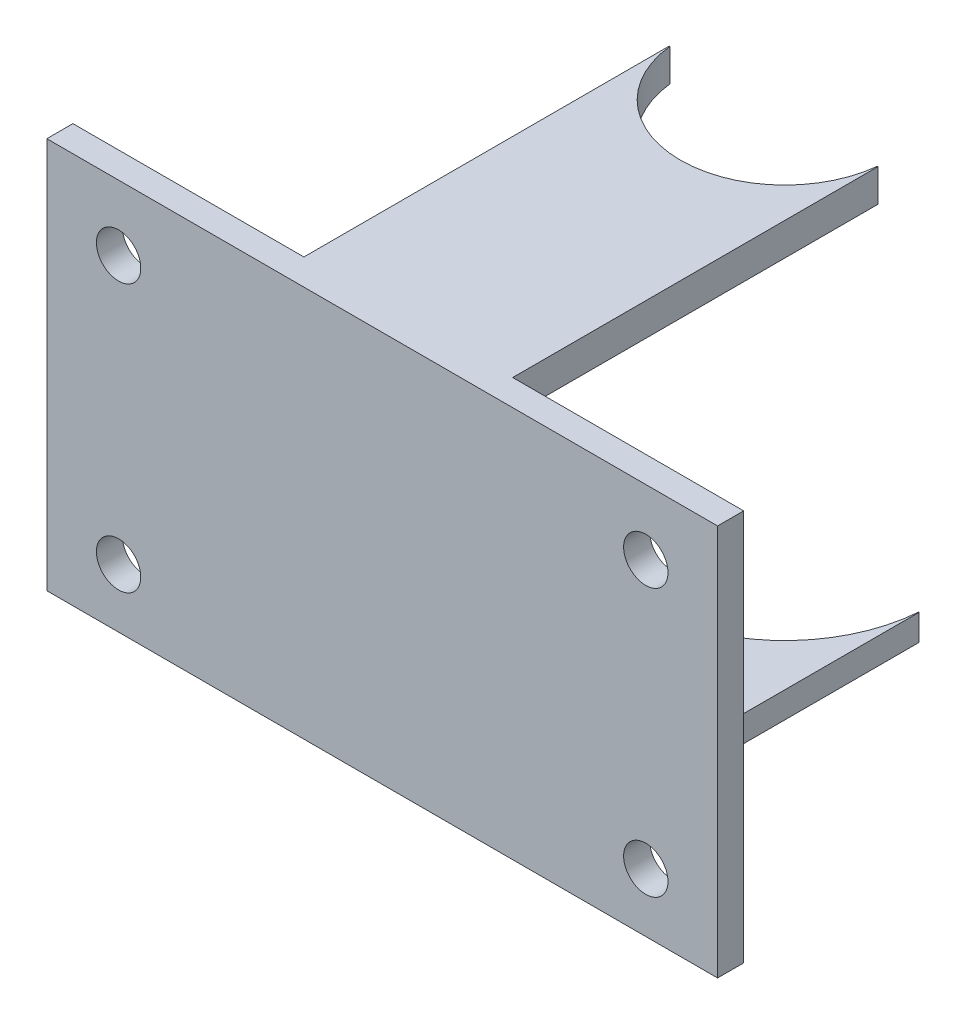
ISO-10303-21;
HEADER;
FILE_DESCRIPTION(('STEP AP214'),'2;1');
FILE_NAME('part.step','',(''),(''),'','','');
FILE_SCHEMA(('AUTOMOTIVE_DESIGN { 1 0 10303 214 1 1 1 1 }'));
ENDSEC;
DATA;
#1=APPLICATION_CONTEXT('core data for automotive mechanical design processes');
#2=APPLICATION_PROTOCOL_DEFINITION('international standard','automotive_design',2000,#1);
#3=PRODUCT_CONTEXT('',#1,'mechanical');
#4=PRODUCT('Part','Part','',(#3));
#5=PRODUCT_RELATED_PRODUCT_CATEGORY('part','',(#4));
#6=PRODUCT_DEFINITION_FORMATION('','',#4);
#7=PRODUCT_DEFINITION_CONTEXT('part definition',#1,'design');
#8=PRODUCT_DEFINITION('design','',#6,#7);
#9=PRODUCT_DEFINITION_SHAPE('','',#8);
#10=(LENGTH_UNIT() NAMED_UNIT(*) SI_UNIT(.MILLI.,.METRE.));
#11=(NAMED_UNIT(*) PLANE_ANGLE_UNIT() SI_UNIT($,.RADIAN.));
#12=(NAMED_UNIT(*) SI_UNIT($,.STERADIAN.) SOLID_ANGLE_UNIT());
#13=UNCERTAINTY_MEASURE_WITH_UNIT(LENGTH_MEASURE(1.E-05),#10,'distance_accuracy_value','');
#14=(GEOMETRIC_REPRESENTATION_CONTEXT(3) GLOBAL_UNCERTAINTY_ASSIGNED_CONTEXT((#13)) GLOBAL_UNIT_ASSIGNED_CONTEXT((#10,
#11,#12)) REPRESENTATION_CONTEXT('',''));
#15=CARTESIAN_POINT('',(0.,0.,0.));
#16=DIRECTION('',(0.,0.,1.));
#17=DIRECTION('',(1.,0.,0.));
#18=AXIS2_PLACEMENT_3D('',#15,#16,#17);
#19=CARTESIAN_POINT('',(0.,0.,-28.));
#20=DIRECTION('',(0.,0.,-1.));
#21=DIRECTION('',(-1.,0.,0.));
#22=AXIS2_PLACEMENT_3D('',#19,#20,#21);
#23=PLANE('',#22);
#24=DIRECTION('',(0.,1.,0.));
#25=VECTOR('',#24,1.);
#26=CARTESIAN_POINT('',(14.5824463122502,-8.00000000000001,-28.));
#27=LINE('',#26,#25);
#28=CARTESIAN_POINT('',(14.5824463122502,0.,-28.));
#29=VERTEX_POINT('',#28);
#30=CARTESIAN_POINT('',(14.5824463122502,1.99999999999999,-28.));
#31=VERTEX_POINT('',#30);
#32=EDGE_CURVE('E11',#29,#31,#27,.T.);
#33=ORIENTED_EDGE('',*,*,#32,.F.);
#34=DIRECTION('',(-1.,0.,0.));
#35=VECTOR('',#34,1.);
#36=CARTESIAN_POINT('',(36.85,0.,-28.));
#37=LINE('',#36,#35);
#38=CARTESIAN_POINT('',(14.55,0.,-28.));
#39=VERTEX_POINT('',#38);
#40=EDGE_CURVE('E286',#29,#39,#37,.T.);
#41=ORIENTED_EDGE('',*,*,#40,.T.);
#42=DIRECTION('',(0.,1.,0.));
#43=VECTOR('',#42,1.);
#44=CARTESIAN_POINT('',(14.55,1.99999999999999,-28.));
#45=LINE('',#44,#43);
#46=CARTESIAN_POINT('',(14.55,1.99999999999999,-28.));
#47=VERTEX_POINT('',#46);
#48=EDGE_CURVE('E159',#39,#47,#45,.T.);
#49=ORIENTED_EDGE('',*,*,#48,.T.);
#50=DIRECTION('',(1.,0.,0.));
#51=VECTOR('',#50,1.);
#52=CARTESIAN_POINT('',(36.85,1.99999999999999,-28.));
#53=LINE('',#52,#51);
#54=EDGE_CURVE('E154',#47,#31,#53,.T.);
#55=ORIENTED_EDGE('',*,*,#54,.T.);
#56=EDGE_LOOP('',(#33,#41,#49,#55));
#57=FACE_BOUND('',#56,.T.);
#58=ADVANCED_FACE('F34',(#57),#23,.T.);
#59=CARTESIAN_POINT('',(0.,0.,-28.));
#60=DIRECTION('',(0.,0.,1.));
#61=DIRECTION('',(1.,0.,0.));
#62=AXIS2_PLACEMENT_3D('',#59,#60,#61);
#63=PLANE('',#62);
#64=DIRECTION('',(-1.,0.,0.));
#65=VECTOR('',#64,1.);
#66=CARTESIAN_POINT('',(33.7,27.5,-28.));
#67=LINE('',#66,#65);
#68=CARTESIAN_POINT('',(33.7,27.5,-28.));
#69=VERTEX_POINT('',#68);
#70=CARTESIAN_POINT('',(33.6547155825962,27.5,-28.));
#71=VERTEX_POINT('',#70);
#72=EDGE_CURVE('E189',#69,#71,#67,.T.);
#73=ORIENTED_EDGE('',*,*,#72,.T.);
#74=DIRECTION('',(0.,1.,0.));
#75=VECTOR('',#74,1.);
#76=CARTESIAN_POINT('',(33.6547155825962,20.,-28.));
#77=LINE('',#76,#75);
#78=CARTESIAN_POINT('',(33.6547155825962,30.,-28.));
#79=VERTEX_POINT('',#78);
#80=EDGE_CURVE('E277',#71,#79,#77,.T.);
#81=ORIENTED_EDGE('',*,*,#80,.T.);
#82=DIRECTION('',(1.,0.,0.));
#83=VECTOR('',#82,1.);
#84=CARTESIAN_POINT('',(33.7,30.,-28.));
#85=LINE('',#84,#83);
#86=CARTESIAN_POINT('',(33.7,30.,-28.));
#87=VERTEX_POINT('',#86);
#88=EDGE_CURVE('E194',#79,#87,#85,.T.);
#89=ORIENTED_EDGE('',*,*,#88,.T.);
#90=DIRECTION('',(0.,-1.,0.));
#91=VECTOR('',#90,1.);
#92=CARTESIAN_POINT('',(33.7,27.5,-28.));
#93=LINE('',#92,#91);
#94=EDGE_CURVE('E184',#87,#69,#93,.T.);
#95=ORIENTED_EDGE('',*,*,#94,.T.);
#96=EDGE_LOOP('',(#73,#81,#89,#95));
#97=FACE_BOUND('',#96,.T.);
#98=ADVANCED_FACE('F301',(#97),#63,.F.);
#99=CARTESIAN_POINT('',(0.,0.,0.));
#100=DIRECTION('',(0.,0.,-1.));
#101=DIRECTION('',(-1.,0.,0.));
#102=AXIS2_PLACEMENT_3D('',#99,#100,#101);
#103=PLANE('',#102);
#104=CARTESIAN_POINT('',(45.9,4.49999999999997,0.));
#105=DIRECTION('',(0.,0.,-1.));
#106=DIRECTION('',(-1.,0.,0.));
#107=AXIS2_PLACEMENT_3D('',#104,#105,#106);
#108=CIRCLE('',#107,1.7);
#109=CARTESIAN_POINT('',(44.2,4.49999999999997,0.));
#110=VERTEX_POINT('',#109);
#111=EDGE_CURVE('E217',#110,#110,#108,.T.);
#112=ORIENTED_EDGE('',*,*,#111,.F.);
#113=EDGE_LOOP('',(#112));
#114=FACE_BOUND('',#113,.T.);
#115=CARTESIAN_POINT('',(5.49999999999998,4.49999999999998,0.));
#116=DIRECTION('',(0.,0.,-1.));
#117=DIRECTION('',(-1.,0.,0.));
#118=AXIS2_PLACEMENT_3D('',#115,#116,#117);
#119=CIRCLE('',#118,1.7);
#120=CARTESIAN_POINT('',(3.79999999999998,4.49999999999998,0.));
#121=VERTEX_POINT('',#120);
#122=EDGE_CURVE('E222',#121,#121,#119,.T.);
#123=ORIENTED_EDGE('',*,*,#122,.F.);
#124=EDGE_LOOP('',(#123));
#125=FACE_BOUND('',#124,.T.);
#126=CARTESIAN_POINT('',(5.49999999999999,25.,0.));
#127=DIRECTION('',(0.,0.,-1.));
#128=DIRECTION('',(-1.,0.,0.));
#129=AXIS2_PLACEMENT_3D('',#126,#127,#128);
#130=CIRCLE('',#129,1.7);
#131=CARTESIAN_POINT('',(3.79999999999999,25.,0.));
#132=VERTEX_POINT('',#131);
#133=EDGE_CURVE('E218',#132,#132,#130,.T.);
#134=ORIENTED_EDGE('',*,*,#133,.F.);
#135=EDGE_LOOP('',(#134));
#136=FACE_BOUND('',#135,.T.);
#137=CARTESIAN_POINT('',(45.9,25.,0.));
#138=DIRECTION('',(0.,0.,-1.));
#139=DIRECTION('',(-1.,0.,0.));
#140=AXIS2_PLACEMENT_3D('',#137,#138,#139);
#141=CIRCLE('',#140,1.7);
#142=CARTESIAN_POINT('',(44.2,25.,0.));
#143=VERTEX_POINT('',#142);
#144=EDGE_CURVE('E221',#143,#143,#141,.T.);
#145=ORIENTED_EDGE('',*,*,#144,.F.);
#146=EDGE_LOOP('',(#145));
#147=FACE_BOUND('',#146,.T.);
#148=DIRECTION('',(1.,0.,0.));
#149=VECTOR('',#148,1.);
#150=CARTESIAN_POINT('',(0.,0.,0.));
#151=LINE('',#150,#149);
#152=CARTESIAN_POINT('',(36.85,0.,0.));
#153=VERTEX_POINT('',#152);
#154=CARTESIAN_POINT('',(51.4,0.,0.));
#155=VERTEX_POINT('',#154);
#156=EDGE_CURVE('E255',#153,#155,#151,.T.);
#157=ORIENTED_EDGE('',*,*,#156,.F.);
#158=DIRECTION('',(0.,-1.,0.));
#159=VECTOR('',#158,1.);
#160=CARTESIAN_POINT('',(36.85,1.99999999999999,0.));
#161=LINE('',#160,#159);
#162=CARTESIAN_POINT('',(36.85,1.99999999999999,0.));
#163=VERTEX_POINT('',#162);
#164=EDGE_CURVE('E169',#163,#153,#161,.T.);
#165=ORIENTED_EDGE('',*,*,#164,.F.);
#166=DIRECTION('',(1.,0.,0.));
#167=VECTOR('',#166,1.);
#168=CARTESIAN_POINT('',(36.85,1.99999999999999,0.));
#169=LINE('',#168,#167);
#170=CARTESIAN_POINT('',(14.55,1.99999999999999,0.));
#171=VERTEX_POINT('',#170);
#172=EDGE_CURVE('E175',#171,#163,#169,.T.);
#173=ORIENTED_EDGE('',*,*,#172,.F.);
#174=DIRECTION('',(0.,1.,0.));
#175=VECTOR('',#174,1.);
#176=CARTESIAN_POINT('',(14.55,1.99999999999999,0.));
#177=LINE('',#176,#175);
#178=CARTESIAN_POINT('',(14.55,0.,0.));
#179=VERTEX_POINT('',#178);
#180=EDGE_CURVE('E172',#179,#171,#177,.T.);
#181=ORIENTED_EDGE('',*,*,#180,.F.);
#182=CARTESIAN_POINT('',(0.,0.,0.));
#183=VERTEX_POINT('',#182);
#184=EDGE_CURVE('E256',#183,#179,#151,.T.);
#185=ORIENTED_EDGE('',*,*,#184,.F.);
#186=DIRECTION('',(0.,-1.,0.));
#187=VECTOR('',#186,1.);
#188=CARTESIAN_POINT('',(0.,0.,0.));
#189=LINE('',#188,#187);
#190=CARTESIAN_POINT('',(0.,30.,0.));
#191=VERTEX_POINT('',#190);
#192=EDGE_CURVE('E241',#191,#183,#189,.T.);
#193=ORIENTED_EDGE('',*,*,#192,.F.);
#194=DIRECTION('',(-1.,0.,0.));
#195=VECTOR('',#194,1.);
#196=CARTESIAN_POINT('',(0.,30.,0.));
#197=LINE('',#196,#195);
#198=CARTESIAN_POINT('',(17.7,30.,0.));
#199=VERTEX_POINT('',#198);
#200=EDGE_CURVE('E261',#199,#191,#197,.T.);
#201=ORIENTED_EDGE('',*,*,#200,.F.);
#202=DIRECTION('',(0.,1.,0.));
#203=VECTOR('',#202,1.);
#204=CARTESIAN_POINT('',(17.7,27.5,0.));
#205=LINE('',#204,#203);
#206=CARTESIAN_POINT('',(17.7,27.5,0.));
#207=VERTEX_POINT('',#206);
#208=EDGE_CURVE('E188',#207,#199,#205,.T.);
#209=ORIENTED_EDGE('',*,*,#208,.F.);
#210=DIRECTION('',(-1.,0.,0.));
#211=VECTOR('',#210,1.);
#212=CARTESIAN_POINT('',(33.7,27.5,0.));
#213=LINE('',#212,#211);
#214=CARTESIAN_POINT('',(33.7,27.5,0.));
#215=VERTEX_POINT('',#214);
#216=EDGE_CURVE('E201',#215,#207,#213,.T.);
#217=ORIENTED_EDGE('',*,*,#216,.F.);
#218=DIRECTION('',(0.,-1.,0.));
#219=VECTOR('',#218,1.);
#220=CARTESIAN_POINT('',(33.7,27.5,0.));
#221=LINE('',#220,#219);
#222=CARTESIAN_POINT('',(33.7,30.,0.));
#223=VERTEX_POINT('',#222);
#224=EDGE_CURVE('E183',#223,#215,#221,.T.);
#225=ORIENTED_EDGE('',*,*,#224,.F.);
#226=CARTESIAN_POINT('',(51.4,30.,0.));
#227=VERTEX_POINT('',#226);
#228=EDGE_CURVE('E246',#227,#223,#197,.T.);
#229=ORIENTED_EDGE('',*,*,#228,.F.);
#230=DIRECTION('',(0.,1.,0.));
#231=VECTOR('',#230,1.);
#232=CARTESIAN_POINT('',(51.4,0.,0.));
#233=LINE('',#232,#231);
#234=EDGE_CURVE('E259',#155,#227,#233,.T.);
#235=ORIENTED_EDGE('',*,*,#234,.F.);
#236=EDGE_LOOP('',(#157,#165,#173,#181,#185,#193,#201,#209,#217,#225,#229,#235));
#237=FACE_BOUND('',#236,.T.);
#238=ADVANCED_FACE('F322',(#114,#125,#136,#147,#237),#103,.T.);
#239=CARTESIAN_POINT('',(0.,0.,2.));
#240=DIRECTION('',(1.,0.,0.));
#241=DIRECTION('',(0.,1.,0.));
#242=AXIS2_PLACEMENT_3D('',#239,#240,#241);
#243=PLANE('',#242);
#244=ORIENTED_EDGE('',*,*,#192,.T.);
#245=DIRECTION('',(0.,0.,-1.));
#246=VECTOR('',#245,1.);
#247=CARTESIAN_POINT('',(0.,0.,2.));
#248=LINE('',#247,#246);
#249=CARTESIAN_POINT('',(0.,0.,2.));
#250=VERTEX_POINT('',#249);
#251=EDGE_CURVE('E272',#250,#183,#248,.T.);
#252=ORIENTED_EDGE('',*,*,#251,.F.);
#253=DIRECTION('',(0.,-1.,0.));
#254=VECTOR('',#253,1.);
#255=CARTESIAN_POINT('',(0.,0.,2.));
#256=LINE('',#255,#254);
#257=CARTESIAN_POINT('',(0.,30.,2.));
#258=VERTEX_POINT('',#257);
#259=EDGE_CURVE('E242',#258,#250,#256,.T.);
#260=ORIENTED_EDGE('',*,*,#259,.F.);
#261=DIRECTION('',(0.,0.,-1.));
#262=VECTOR('',#261,1.);
#263=CARTESIAN_POINT('',(0.,30.,2.));
#264=LINE('',#263,#262);
#265=EDGE_CURVE('E252',#258,#191,#264,.T.);
#266=ORIENTED_EDGE('',*,*,#265,.T.);
#267=EDGE_LOOP('',(#244,#252,#260,#266));
#268=FACE_BOUND('',#267,.T.);
#269=ADVANCED_FACE('F36',(#268),#243,.F.);
#270=CARTESIAN_POINT('',(0.,0.,2.));
#271=DIRECTION('',(0.,1.,0.));
#272=DIRECTION('',(0.,0.,1.));
#273=AXIS2_PLACEMENT_3D('',#270,#271,#272);
#274=PLANE('',#273);
#275=ORIENTED_EDGE('',*,*,#40,.F.);
#276=CARTESIAN_POINT('',(25.7,0.,-28.8500000000009));
#277=DIRECTION('',(0.,1.,0.));
#278=DIRECTION('',(0.,0.,1.));
#279=AXIS2_PLACEMENT_3D('',#276,#277,#278);
#280=CIRCLE('',#279,11.15);
#281=CARTESIAN_POINT('',(36.8175536877498,0.,-28.));
#282=VERTEX_POINT('',#281);
#283=EDGE_CURVE('E146',#29,#282,#280,.T.);
#284=ORIENTED_EDGE('',*,*,#283,.T.);
#285=CARTESIAN_POINT('',(36.85,0.,-28.));
#286=VERTEX_POINT('',#285);
#287=EDGE_CURVE('E283',#286,#282,#37,.T.);
#288=ORIENTED_EDGE('',*,*,#287,.F.);
#289=DIRECTION('',(0.,0.,1.));
#290=VECTOR('',#289,1.);
#291=CARTESIAN_POINT('',(36.85,0.,-28.));
#292=LINE('',#291,#290);
#293=EDGE_CURVE('E181',#286,#153,#292,.T.);
#294=ORIENTED_EDGE('',*,*,#293,.T.);
#295=ORIENTED_EDGE('',*,*,#156,.T.);
#296=DIRECTION('',(0.,0.,-1.));
#297=VECTOR('',#296,1.);
#298=CARTESIAN_POINT('',(51.4,0.,2.));
#299=LINE('',#298,#297);
#300=CARTESIAN_POINT('',(51.4,0.,2.));
#301=VERTEX_POINT('',#300);
#302=EDGE_CURVE('E269',#301,#155,#299,.T.);
#303=ORIENTED_EDGE('',*,*,#302,.F.);
#304=DIRECTION('',(1.,0.,0.));
#305=VECTOR('',#304,1.);
#306=CARTESIAN_POINT('',(0.,0.,2.));
#307=LINE('',#306,#305);
#308=EDGE_CURVE('E245',#250,#301,#307,.T.);
#309=ORIENTED_EDGE('',*,*,#308,.F.);
#310=ORIENTED_EDGE('',*,*,#251,.T.);
#311=ORIENTED_EDGE('',*,*,#184,.T.);
#312=DIRECTION('',(0.,0.,1.));
#313=VECTOR('',#312,1.);
#314=CARTESIAN_POINT('',(14.55,0.,-28.));
#315=LINE('',#314,#313);
#316=EDGE_CURVE('E179',#39,#179,#315,.T.);
#317=ORIENTED_EDGE('',*,*,#316,.F.);
#318=EDGE_LOOP('',(#275,#284,#288,#294,#295,#303,#309,#310,#311,#317));
#319=FACE_BOUND('',#318,.T.);
#320=ADVANCED_FACE('F282',(#319),#274,.F.);
#321=CARTESIAN_POINT('',(51.4,0.,2.));
#322=DIRECTION('',(-1.,0.,0.));
#323=DIRECTION('',(0.,-1.,0.));
#324=AXIS2_PLACEMENT_3D('',#321,#322,#323);
#325=PLANE('',#324);
#326=ORIENTED_EDGE('',*,*,#234,.T.);
#327=DIRECTION('',(0.,0.,-1.));
#328=VECTOR('',#327,1.);
#329=CARTESIAN_POINT('',(51.4,30.,2.));
#330=LINE('',#329,#328);
#331=CARTESIAN_POINT('',(51.4,30.,2.));
#332=VERTEX_POINT('',#331);
#333=EDGE_CURVE('E266',#332,#227,#330,.T.);
#334=ORIENTED_EDGE('',*,*,#333,.F.);
#335=DIRECTION('',(0.,1.,0.));
#336=VECTOR('',#335,1.);
#337=CARTESIAN_POINT('',(51.4,0.,2.));
#338=LINE('',#337,#336);
#339=EDGE_CURVE('E248',#301,#332,#338,.T.);
#340=ORIENTED_EDGE('',*,*,#339,.F.);
#341=ORIENTED_EDGE('',*,*,#302,.T.);
#342=EDGE_LOOP('',(#326,#334,#340,#341));
#343=FACE_BOUND('',#342,.T.);
#344=ADVANCED_FACE('F335',(#343),#325,.F.);
#345=CARTESIAN_POINT('',(0.,30.,2.));
#346=DIRECTION('',(0.,-1.,0.));
#347=DIRECTION('',(0.,0.,-1.));
#348=AXIS2_PLACEMENT_3D('',#345,#346,#347);
#349=PLANE('',#348);
#350=ORIENTED_EDGE('',*,*,#88,.F.);
#351=CARTESIAN_POINT('',(25.7,30.,-28.8500000000009));
#352=DIRECTION('',(0.,1.,0.));
#353=DIRECTION('',(0.,0.,1.));
#354=AXIS2_PLACEMENT_3D('',#351,#352,#353);
#355=CIRCLE('',#354,8.);
#356=CARTESIAN_POINT('',(17.7452844174038,30.,-28.));
#357=VERTEX_POINT('',#356);
#358=EDGE_CURVE('E287',#357,#79,#355,.T.);
#359=ORIENTED_EDGE('',*,*,#358,.F.);
#360=CARTESIAN_POINT('',(17.7,30.,-28.));
#361=VERTEX_POINT('',#360);
#362=EDGE_CURVE('E195',#361,#357,#85,.T.);
#363=ORIENTED_EDGE('',*,*,#362,.F.);
#364=DIRECTION('',(0.,0.,1.));
#365=VECTOR('',#364,1.);
#366=CARTESIAN_POINT('',(17.7,30.,-28.));
#367=LINE('',#366,#365);
#368=EDGE_CURVE('E208',#361,#199,#367,.T.);
#369=ORIENTED_EDGE('',*,*,#368,.T.);
#370=ORIENTED_EDGE('',*,*,#200,.T.);
#371=ORIENTED_EDGE('',*,*,#265,.F.);
#372=DIRECTION('',(-1.,0.,0.));
#373=VECTOR('',#372,1.);
#374=CARTESIAN_POINT('',(0.,30.,2.));
#375=LINE('',#374,#373);
#376=EDGE_CURVE('E250',#332,#258,#375,.T.);
#377=ORIENTED_EDGE('',*,*,#376,.F.);
#378=ORIENTED_EDGE('',*,*,#333,.T.);
#379=ORIENTED_EDGE('',*,*,#228,.T.);
#380=DIRECTION('',(0.,0.,1.));
#381=VECTOR('',#380,1.);
#382=CARTESIAN_POINT('',(33.7,30.,-28.));
#383=LINE('',#382,#381);
#384=EDGE_CURVE('E198',#87,#223,#383,.T.);
#385=ORIENTED_EDGE('',*,*,#384,.F.);
#386=EDGE_LOOP('',(#350,#359,#363,#369,#370,#371,#377,#378,#379,#385));
#387=FACE_BOUND('',#386,.T.);
#388=ADVANCED_FACE('F303',(#387),#349,.F.);
#389=CARTESIAN_POINT('',(0.,0.,2.));
#390=DIRECTION('',(0.,0.,-1.));
#391=DIRECTION('',(-1.,0.,0.));
#392=AXIS2_PLACEMENT_3D('',#389,#390,#391);
#393=PLANE('',#392);
#394=CARTESIAN_POINT('',(45.9,4.49999999999997,2.));
#395=DIRECTION('',(0.,0.,-1.));
#396=DIRECTION('',(-1.,0.,0.));
#397=AXIS2_PLACEMENT_3D('',#394,#395,#396);
#398=CIRCLE('',#397,1.7);
#399=CARTESIAN_POINT('',(44.2,4.49999999999997,2.));
#400=VERTEX_POINT('',#399);
#401=EDGE_CURVE('E238',#400,#400,#398,.T.);
#402=ORIENTED_EDGE('',*,*,#401,.T.);
#403=EDGE_LOOP('',(#402));
#404=FACE_BOUND('',#403,.T.);
#405=CARTESIAN_POINT('',(5.49999999999998,4.49999999999998,2.));
#406=DIRECTION('',(0.,0.,-1.));
#407=DIRECTION('',(-1.,0.,0.));
#408=AXIS2_PLACEMENT_3D('',#405,#406,#407);
#409=CIRCLE('',#408,1.7);
#410=CARTESIAN_POINT('',(3.79999999999998,4.49999999999998,2.));
#411=VERTEX_POINT('',#410);
#412=EDGE_CURVE('E235',#411,#411,#409,.T.);
#413=ORIENTED_EDGE('',*,*,#412,.T.);
#414=EDGE_LOOP('',(#413));
#415=FACE_BOUND('',#414,.T.);
#416=CARTESIAN_POINT('',(5.49999999999999,25.,2.));
#417=DIRECTION('',(0.,0.,-1.));
#418=DIRECTION('',(-1.,0.,0.));
#419=AXIS2_PLACEMENT_3D('',#416,#417,#418);
#420=CIRCLE('',#419,1.7);
#421=CARTESIAN_POINT('',(3.79999999999999,25.,2.));
#422=VERTEX_POINT('',#421);
#423=EDGE_CURVE('E232',#422,#422,#420,.T.);
#424=ORIENTED_EDGE('',*,*,#423,.T.);
#425=EDGE_LOOP('',(#424));
#426=FACE_BOUND('',#425,.T.);
#427=CARTESIAN_POINT('',(45.9,25.,2.));
#428=DIRECTION('',(0.,0.,-1.));
#429=DIRECTION('',(-1.,0.,0.));
#430=AXIS2_PLACEMENT_3D('',#427,#428,#429);
#431=CIRCLE('',#430,1.7);
#432=CARTESIAN_POINT('',(44.2,25.,2.));
#433=VERTEX_POINT('',#432);
#434=EDGE_CURVE('E229',#433,#433,#431,.T.);
#435=ORIENTED_EDGE('',*,*,#434,.T.);
#436=EDGE_LOOP('',(#435));
#437=FACE_BOUND('',#436,.T.);
#438=ORIENTED_EDGE('',*,*,#259,.T.);
#439=ORIENTED_EDGE('',*,*,#308,.T.);
#440=ORIENTED_EDGE('',*,*,#339,.T.);
#441=ORIENTED_EDGE('',*,*,#376,.T.);
#442=EDGE_LOOP('',(#438,#439,#440,#441));
#443=FACE_BOUND('',#442,.T.);
#444=ADVANCED_FACE('F331',(#404,#415,#426,#437,#443),#393,.F.);
#445=CARTESIAN_POINT('',(45.9,25.,15.));
#446=DIRECTION('',(0.,0.,-1.));
#447=DIRECTION('',(-1.,0.,0.));
#448=AXIS2_PLACEMENT_3D('',#445,#446,#447);
#449=CYLINDRICAL_SURFACE('',#448,1.7);
#450=ORIENTED_EDGE('',*,*,#144,.T.);
#451=EDGE_LOOP('',(#450));
#452=FACE_BOUND('',#451,.T.);
#453=ORIENTED_EDGE('',*,*,#434,.F.);
#454=EDGE_LOOP('',(#453));
#455=FACE_BOUND('',#454,.T.);
#456=ADVANCED_FACE('F492',(#452,#455),#449,.F.);
#457=CARTESIAN_POINT('',(5.49999999999999,25.,15.));
#458=DIRECTION('',(0.,0.,-1.));
#459=DIRECTION('',(-1.,0.,0.));
#460=AXIS2_PLACEMENT_3D('',#457,#458,#459);
#461=CYLINDRICAL_SURFACE('',#460,1.7);
#462=ORIENTED_EDGE('',*,*,#133,.T.);
#463=EDGE_LOOP('',(#462));
#464=FACE_BOUND('',#463,.T.);
#465=ORIENTED_EDGE('',*,*,#423,.F.);
#466=EDGE_LOOP('',(#465));
#467=FACE_BOUND('',#466,.T.);
#468=ADVANCED_FACE('F482',(#464,#467),#461,.F.);
#469=CARTESIAN_POINT('',(5.49999999999998,4.49999999999998,15.));
#470=DIRECTION('',(0.,0.,-1.));
#471=DIRECTION('',(-1.,0.,0.));
#472=AXIS2_PLACEMENT_3D('',#469,#470,#471);
#473=CYLINDRICAL_SURFACE('',#472,1.7);
#474=ORIENTED_EDGE('',*,*,#122,.T.);
#475=EDGE_LOOP('',(#474));
#476=FACE_BOUND('',#475,.T.);
#477=ORIENTED_EDGE('',*,*,#412,.F.);
#478=EDGE_LOOP('',(#477));
#479=FACE_BOUND('',#478,.T.);
#480=ADVANCED_FACE('F472',(#476,#479),#473,.F.);
#481=CARTESIAN_POINT('',(45.9,4.49999999999997,15.));
#482=DIRECTION('',(0.,0.,-1.));
#483=DIRECTION('',(-1.,0.,0.));
#484=AXIS2_PLACEMENT_3D('',#481,#482,#483);
#485=CYLINDRICAL_SURFACE('',#484,1.7);
#486=ORIENTED_EDGE('',*,*,#111,.T.);
#487=EDGE_LOOP('',(#486));
#488=FACE_BOUND('',#487,.T.);
#489=ORIENTED_EDGE('',*,*,#401,.F.);
#490=EDGE_LOOP('',(#489));
#491=FACE_BOUND('',#490,.T.);
#492=ADVANCED_FACE('F456',(#488,#491),#485,.F.);
#493=CARTESIAN_POINT('',(33.7,27.5,-28.));
#494=DIRECTION('',(-1.,0.,0.));
#495=DIRECTION('',(0.,0.,1.));
#496=AXIS2_PLACEMENT_3D('',#493,#494,#495);
#497=PLANE('',#496);
#498=ORIENTED_EDGE('',*,*,#224,.T.);
#499=DIRECTION('',(0.,0.,1.));
#500=VECTOR('',#499,1.);
#501=CARTESIAN_POINT('',(33.7,27.5,-28.));
#502=LINE('',#501,#500);
#503=EDGE_CURVE('E214',#69,#215,#502,.T.);
#504=ORIENTED_EDGE('',*,*,#503,.F.);
#505=ORIENTED_EDGE('',*,*,#94,.F.);
#506=ORIENTED_EDGE('',*,*,#384,.T.);
#507=EDGE_LOOP('',(#498,#504,#505,#506));
#508=FACE_BOUND('',#507,.T.);
#509=ADVANCED_FACE('F308',(#508),#497,.F.);
#510=CARTESIAN_POINT('',(33.7,27.5,-28.));
#511=DIRECTION('',(0.,1.,0.));
#512=DIRECTION('',(0.,0.,1.));
#513=AXIS2_PLACEMENT_3D('',#510,#511,#512);
#514=PLANE('',#513);
#515=CARTESIAN_POINT('',(17.7452844174038,27.5,-28.));
#516=VERTEX_POINT('',#515);
#517=CARTESIAN_POINT('',(17.7,27.5,-28.));
#518=VERTEX_POINT('',#517);
#519=EDGE_CURVE('E187',#516,#518,#67,.T.);
#520=ORIENTED_EDGE('',*,*,#519,.F.);
#521=CARTESIAN_POINT('',(25.7,27.5,-28.8500000000009));
#522=DIRECTION('',(0.,1.,0.));
#523=DIRECTION('',(0.,0.,1.));
#524=AXIS2_PLACEMENT_3D('',#521,#522,#523);
#525=CIRCLE('',#524,8.);
#526=EDGE_CURVE('E56',#516,#71,#525,.T.);
#527=ORIENTED_EDGE('',*,*,#526,.T.);
#528=ORIENTED_EDGE('',*,*,#72,.F.);
#529=ORIENTED_EDGE('',*,*,#503,.T.);
#530=ORIENTED_EDGE('',*,*,#216,.T.);
#531=DIRECTION('',(0.,0.,1.));
#532=VECTOR('',#531,1.);
#533=CARTESIAN_POINT('',(17.7,27.5,-28.));
#534=LINE('',#533,#532);
#535=EDGE_CURVE('E211',#518,#207,#534,.T.);
#536=ORIENTED_EDGE('',*,*,#535,.F.);
#537=EDGE_LOOP('',(#520,#527,#528,#529,#530,#536));
#538=FACE_BOUND('',#537,.T.);
#539=ADVANCED_FACE('F311',(#538),#514,.F.);
#540=CARTESIAN_POINT('',(17.7,27.5,-28.));
#541=DIRECTION('',(1.,0.,0.));
#542=DIRECTION('',(0.,0.,-1.));
#543=AXIS2_PLACEMENT_3D('',#540,#541,#542);
#544=PLANE('',#543);
#545=ORIENTED_EDGE('',*,*,#208,.T.);
#546=ORIENTED_EDGE('',*,*,#368,.F.);
#547=DIRECTION('',(0.,1.,0.));
#548=VECTOR('',#547,1.);
#549=CARTESIAN_POINT('',(17.7,27.5,-28.));
#550=LINE('',#549,#548);
#551=EDGE_CURVE('E192',#518,#361,#550,.T.);
#552=ORIENTED_EDGE('',*,*,#551,.F.);
#553=ORIENTED_EDGE('',*,*,#535,.T.);
#554=EDGE_LOOP('',(#545,#546,#552,#553));
#555=FACE_BOUND('',#554,.T.);
#556=ADVANCED_FACE('F319',(#555),#544,.F.);
#557=ORIENTED_EDGE('',*,*,#362,.T.);
#558=DIRECTION('',(0.,1.,0.));
#559=VECTOR('',#558,1.);
#560=CARTESIAN_POINT('',(17.7452844174038,20.,-28.));
#561=LINE('',#560,#559);
#562=EDGE_CURVE('E275',#357,#516,#561,.F.);
#563=ORIENTED_EDGE('',*,*,#562,.T.);
#564=ORIENTED_EDGE('',*,*,#519,.T.);
#565=ORIENTED_EDGE('',*,*,#551,.T.);
#566=EDGE_LOOP('',(#557,#563,#564,#565));
#567=FACE_BOUND('',#566,.T.);
#568=ADVANCED_FACE('F315',(#567),#63,.F.);
#569=CARTESIAN_POINT('',(36.85,1.99999999999999,-28.));
#570=DIRECTION('',(-1.,0.,0.));
#571=DIRECTION('',(0.,0.,1.));
#572=AXIS2_PLACEMENT_3D('',#569,#570,#571);
#573=PLANE('',#572);
#574=ORIENTED_EDGE('',*,*,#164,.T.);
#575=ORIENTED_EDGE('',*,*,#293,.F.);
#576=DIRECTION('',(0.,-1.,0.));
#577=VECTOR('',#576,1.);
#578=CARTESIAN_POINT('',(36.85,1.99999999999999,-28.));
#579=LINE('',#578,#577);
#580=CARTESIAN_POINT('',(36.85,1.99999999999999,-28.));
#581=VERTEX_POINT('',#580);
#582=EDGE_CURVE('E176',#581,#286,#579,.T.);
#583=ORIENTED_EDGE('',*,*,#582,.F.);
#584=DIRECTION('',(0.,0.,1.));
#585=VECTOR('',#584,1.);
#586=CARTESIAN_POINT('',(36.85,1.99999999999999,-28.));
#587=LINE('',#586,#585);
#588=EDGE_CURVE('E161',#581,#163,#587,.T.);
#589=ORIENTED_EDGE('',*,*,#588,.T.);
#590=EDGE_LOOP('',(#574,#575,#583,#589));
#591=FACE_BOUND('',#590,.T.);
#592=ADVANCED_FACE('F340',(#591),#573,.F.);
#593=CARTESIAN_POINT('',(14.55,1.99999999999999,-28.));
#594=DIRECTION('',(1.,0.,0.));
#595=DIRECTION('',(0.,1.,0.));
#596=AXIS2_PLACEMENT_3D('',#593,#594,#595);
#597=PLANE('',#596);
#598=ORIENTED_EDGE('',*,*,#180,.T.);
#599=DIRECTION('',(0.,0.,1.));
#600=VECTOR('',#599,1.);
#601=CARTESIAN_POINT('',(14.55,1.99999999999999,-28.));
#602=LINE('',#601,#600);
#603=EDGE_CURVE('E164',#47,#171,#602,.T.);
#604=ORIENTED_EDGE('',*,*,#603,.F.);
#605=ORIENTED_EDGE('',*,*,#48,.F.);
#606=ORIENTED_EDGE('',*,*,#316,.T.);
#607=EDGE_LOOP('',(#598,#604,#605,#606));
#608=FACE_BOUND('',#607,.T.);
#609=ADVANCED_FACE('F342',(#608),#597,.F.);
#610=CARTESIAN_POINT('',(36.85,1.99999999999999,-28.));
#611=DIRECTION('',(0.,-1.,0.));
#612=DIRECTION('',(0.,0.,-1.));
#613=AXIS2_PLACEMENT_3D('',#610,#611,#612);
#614=PLANE('',#613);
#615=CARTESIAN_POINT('',(36.8175536877498,1.99999999999999,-28.));
#616=VERTEX_POINT('',#615);
#617=EDGE_CURVE('E156',#616,#581,#53,.T.);
#618=ORIENTED_EDGE('',*,*,#617,.F.);
#619=CARTESIAN_POINT('',(25.7,1.99999999999999,-28.8500000000009));
#620=DIRECTION('',(0.,1.,0.));
#621=DIRECTION('',(-1.,0.,0.));
#622=AXIS2_PLACEMENT_3D('',#619,#620,#621);
#623=CIRCLE('',#622,11.15);
#624=EDGE_CURVE('E48',#31,#616,#623,.T.);
#625=ORIENTED_EDGE('',*,*,#624,.F.);
#626=ORIENTED_EDGE('',*,*,#54,.F.);
#627=ORIENTED_EDGE('',*,*,#603,.T.);
#628=ORIENTED_EDGE('',*,*,#172,.T.);
#629=ORIENTED_EDGE('',*,*,#588,.F.);
#630=EDGE_LOOP('',(#618,#625,#626,#627,#628,#629));
#631=FACE_BOUND('',#630,.T.);
#632=ADVANCED_FACE('F153',(#631),#614,.F.);
#633=DIRECTION('',(0.,1.,0.));
#634=VECTOR('',#633,1.);
#635=CARTESIAN_POINT('',(36.8175536877498,-8.00000000000001,-28.));
#636=LINE('',#635,#634);
#637=EDGE_CURVE('E42',#616,#282,#636,.F.);
#638=ORIENTED_EDGE('',*,*,#637,.F.);
#639=ORIENTED_EDGE('',*,*,#617,.T.);
#640=ORIENTED_EDGE('',*,*,#582,.T.);
#641=ORIENTED_EDGE('',*,*,#287,.T.);
#642=EDGE_LOOP('',(#638,#639,#640,#641));
#643=FACE_BOUND('',#642,.T.);
#644=ADVANCED_FACE('F289',(#643),#23,.T.);
#645=CARTESIAN_POINT('',(25.7,20.,-28.8500000000009));
#646=DIRECTION('',(0.,1.,0.));
#647=DIRECTION('',(0.,0.,1.));
#648=AXIS2_PLACEMENT_3D('',#645,#646,#647);
#649=CYLINDRICAL_SURFACE('',#648,8.);
#650=ORIENTED_EDGE('',*,*,#526,.F.);
#651=ORIENTED_EDGE('',*,*,#562,.F.);
#652=ORIENTED_EDGE('',*,*,#358,.T.);
#653=ORIENTED_EDGE('',*,*,#80,.F.);
#654=EDGE_LOOP('',(#650,#651,#652,#653));
#655=FACE_BOUND('',#654,.T.);
#656=ADVANCED_FACE('F296',(#655),#649,.F.);
#657=CARTESIAN_POINT('',(25.7,-8.00000000000001,-28.8500000000009));
#658=DIRECTION('',(0.,1.,0.));
#659=DIRECTION('',(-1.,0.,0.));
#660=AXIS2_PLACEMENT_3D('',#657,#658,#659);
#661=CYLINDRICAL_SURFACE('',#660,11.15);
#662=ORIENTED_EDGE('',*,*,#32,.T.);
#663=ORIENTED_EDGE('',*,*,#624,.T.);
#664=ORIENTED_EDGE('',*,*,#637,.T.);
#665=ORIENTED_EDGE('',*,*,#283,.F.);
#666=EDGE_LOOP('',(#662,#663,#664,#665));
#667=FACE_BOUND('',#666,.T.);
#668=ADVANCED_FACE('F144',(#667),#661,.F.);
#669=CLOSED_SHELL('',(#58,#98,#238,#269,#320,#344,#388,#444,#456,#468,#480,#492,#509,#539,#556,
#568,#592,#609,#632,#644,#656,#668));
#670=MANIFOLD_SOLID_BREP('B2',#669);
#671=ADVANCED_BREP_SHAPE_REPRESENTATION('',(#18,#670),#14);
#672=SHAPE_DEFINITION_REPRESENTATION(#9,#671);
ENDSEC;
END-ISO-10303-21;
